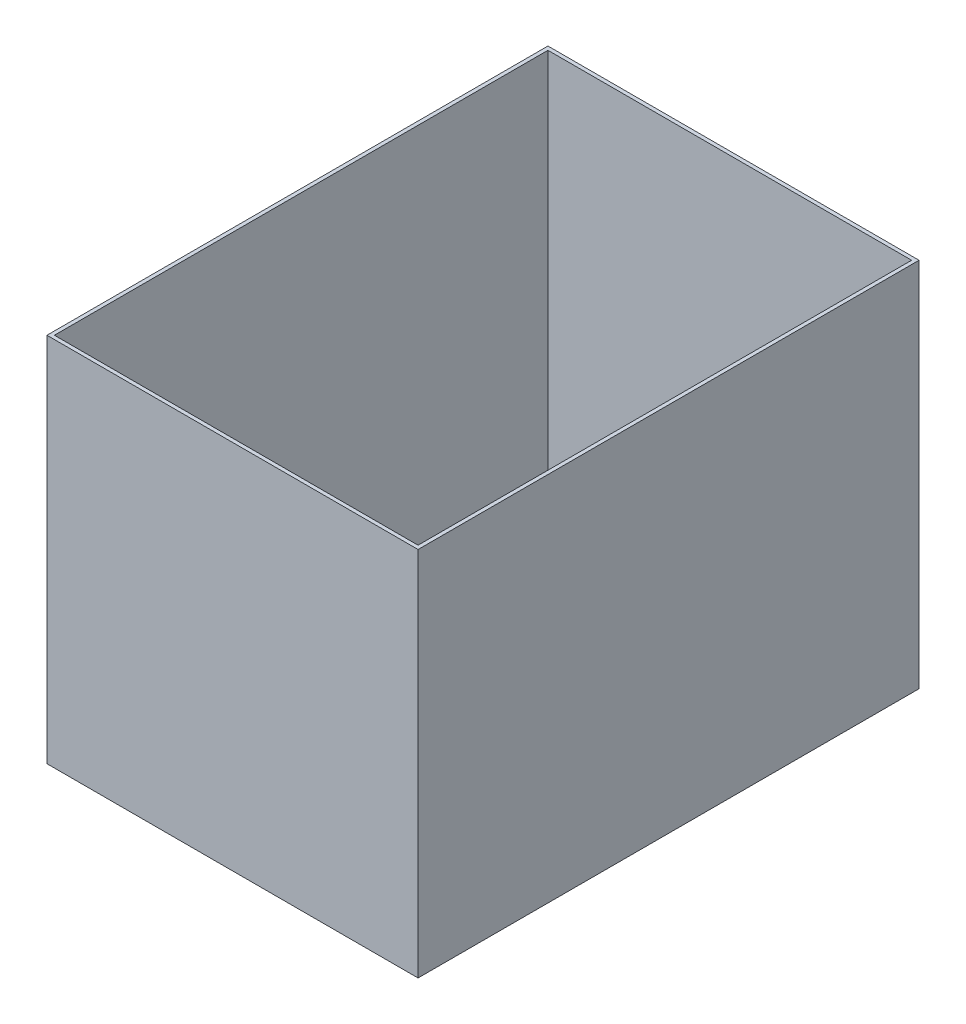
ISO-10303-21;
HEADER;
FILE_DESCRIPTION(('STEP AP214'),'2;1');
FILE_NAME('part.step','',(''),(''),'','','');
FILE_SCHEMA(('AUTOMOTIVE_DESIGN { 1 0 10303 214 1 1 1 1 }'));
ENDSEC;
DATA;
#1=APPLICATION_CONTEXT('core data for automotive mechanical design processes');
#2=APPLICATION_PROTOCOL_DEFINITION('international standard','automotive_design',2000,#1);
#3=PRODUCT_CONTEXT('',#1,'mechanical');
#4=PRODUCT('Part','Part','',(#3));
#5=PRODUCT_RELATED_PRODUCT_CATEGORY('part','',(#4));
#6=PRODUCT_DEFINITION_FORMATION('','',#4);
#7=PRODUCT_DEFINITION_CONTEXT('part definition',#1,'design');
#8=PRODUCT_DEFINITION('design','',#6,#7);
#9=PRODUCT_DEFINITION_SHAPE('','',#8);
#10=(LENGTH_UNIT() NAMED_UNIT(*) SI_UNIT(.MILLI.,.METRE.));
#11=(NAMED_UNIT(*) PLANE_ANGLE_UNIT() SI_UNIT($,.RADIAN.));
#12=(NAMED_UNIT(*) SI_UNIT($,.STERADIAN.) SOLID_ANGLE_UNIT());
#13=UNCERTAINTY_MEASURE_WITH_UNIT(LENGTH_MEASURE(1.E-05),#10,'distance_accuracy_value','');
#14=(GEOMETRIC_REPRESENTATION_CONTEXT(3) GLOBAL_UNCERTAINTY_ASSIGNED_CONTEXT((#13)) GLOBAL_UNIT_ASSIGNED_CONTEXT((#10,
#11,#12)) REPRESENTATION_CONTEXT('',''));
#15=CARTESIAN_POINT('',(0.,0.,0.));
#16=DIRECTION('',(0.,0.,1.));
#17=DIRECTION('',(1.,0.,0.));
#18=AXIS2_PLACEMENT_3D('',#15,#16,#17);
#19=CARTESIAN_POINT('',(-100.,200.,-135.));
#20=DIRECTION('',(0.,0.,-1.));
#21=DIRECTION('',(-1.,0.,0.));
#22=AXIS2_PLACEMENT_3D('',#19,#20,#21);
#23=PLANE('',#22);
#24=DIRECTION('',(1.,0.,0.));
#25=VECTOR('',#24,1.);
#26=CARTESIAN_POINT('',(-100.,0.,-135.));
#27=LINE('',#26,#25);
#28=CARTESIAN_POINT('',(-100.,0.,-135.));
#29=VERTEX_POINT('',#28);
#30=CARTESIAN_POINT('',(100.,0.,-135.));
#31=VERTEX_POINT('',#30);
#32=EDGE_CURVE('E122',#29,#31,#27,.T.);
#33=ORIENTED_EDGE('',*,*,#32,.F.);
#34=DIRECTION('',(0.,-1.,0.));
#35=VECTOR('',#34,1.);
#36=CARTESIAN_POINT('',(-100.,200.,-135.));
#37=LINE('',#36,#35);
#38=CARTESIAN_POINT('',(-100.,200.,-135.));
#39=VERTEX_POINT('',#38);
#40=EDGE_CURVE('E11',#39,#29,#37,.T.);
#41=ORIENTED_EDGE('',*,*,#40,.F.);
#42=DIRECTION('',(1.,0.,0.));
#43=VECTOR('',#42,1.);
#44=CARTESIAN_POINT('',(-100.,200.,-135.));
#45=LINE('',#44,#43);
#46=CARTESIAN_POINT('',(100.,200.,-135.));
#47=VERTEX_POINT('',#46);
#48=EDGE_CURVE('E170',#39,#47,#45,.T.);
#49=ORIENTED_EDGE('',*,*,#48,.T.);
#50=DIRECTION('',(0.,-1.,0.));
#51=VECTOR('',#50,1.);
#52=CARTESIAN_POINT('',(100.,200.,-135.));
#53=LINE('',#52,#51);
#54=EDGE_CURVE('E87',#47,#31,#53,.T.);
#55=ORIENTED_EDGE('',*,*,#54,.T.);
#56=EDGE_LOOP('',(#33,#41,#49,#55));
#57=FACE_BOUND('',#56,.T.);
#58=ADVANCED_FACE('F38',(#57),#23,.T.);
#59=CARTESIAN_POINT('',(-100.,200.,-135.));
#60=DIRECTION('',(1.,0.,0.));
#61=DIRECTION('',(0.,0.,-1.));
#62=AXIS2_PLACEMENT_3D('',#59,#60,#61);
#63=PLANE('',#62);
#64=DIRECTION('',(0.,0.,1.));
#65=VECTOR('',#64,1.);
#66=CARTESIAN_POINT('',(-100.,0.,-135.));
#67=LINE('',#66,#65);
#68=CARTESIAN_POINT('',(-100.,0.,135.));
#69=VERTEX_POINT('',#68);
#70=EDGE_CURVE('E174',#29,#69,#67,.T.);
#71=ORIENTED_EDGE('',*,*,#70,.T.);
#72=DIRECTION('',(0.,-1.,0.));
#73=VECTOR('',#72,1.);
#74=CARTESIAN_POINT('',(-100.,200.,135.));
#75=LINE('',#74,#73);
#76=CARTESIAN_POINT('',(-100.,200.,135.));
#77=VERTEX_POINT('',#76);
#78=EDGE_CURVE('E47',#77,#69,#75,.T.);
#79=ORIENTED_EDGE('',*,*,#78,.F.);
#80=DIRECTION('',(0.,0.,1.));
#81=VECTOR('',#80,1.);
#82=CARTESIAN_POINT('',(-100.,200.,-135.));
#83=LINE('',#82,#81);
#84=EDGE_CURVE('E180',#39,#77,#83,.T.);
#85=ORIENTED_EDGE('',*,*,#84,.F.);
#86=ORIENTED_EDGE('',*,*,#40,.T.);
#87=EDGE_LOOP('',(#71,#79,#85,#86));
#88=FACE_BOUND('',#87,.T.);
#89=ADVANCED_FACE('F234',(#88),#63,.F.);
#90=CARTESIAN_POINT('',(-100.,200.,135.));
#91=DIRECTION('',(0.,0.,-1.));
#92=DIRECTION('',(-1.,0.,0.));
#93=AXIS2_PLACEMENT_3D('',#90,#91,#92);
#94=PLANE('',#93);
#95=DIRECTION('',(1.,0.,0.));
#96=VECTOR('',#95,1.);
#97=CARTESIAN_POINT('',(-100.,0.,135.));
#98=LINE('',#97,#96);
#99=CARTESIAN_POINT('',(100.,0.,135.));
#100=VERTEX_POINT('',#99);
#101=EDGE_CURVE('E190',#69,#100,#98,.T.);
#102=ORIENTED_EDGE('',*,*,#101,.T.);
#103=DIRECTION('',(0.,-1.,0.));
#104=VECTOR('',#103,1.);
#105=CARTESIAN_POINT('',(100.,200.,135.));
#106=LINE('',#105,#104);
#107=CARTESIAN_POINT('',(100.,200.,135.));
#108=VERTEX_POINT('',#107);
#109=EDGE_CURVE('E199',#108,#100,#106,.T.);
#110=ORIENTED_EDGE('',*,*,#109,.F.);
#111=DIRECTION('',(1.,0.,0.));
#112=VECTOR('',#111,1.);
#113=CARTESIAN_POINT('',(-100.,200.,135.));
#114=LINE('',#113,#112);
#115=EDGE_CURVE('E177',#77,#108,#114,.T.);
#116=ORIENTED_EDGE('',*,*,#115,.F.);
#117=ORIENTED_EDGE('',*,*,#78,.T.);
#118=EDGE_LOOP('',(#102,#110,#116,#117));
#119=FACE_BOUND('',#118,.T.);
#120=ADVANCED_FACE('F238',(#119),#94,.F.);
#121=CARTESIAN_POINT('',(100.,200.,-135.));
#122=DIRECTION('',(1.,0.,0.));
#123=DIRECTION('',(0.,0.,-1.));
#124=AXIS2_PLACEMENT_3D('',#121,#122,#123);
#125=PLANE('',#124);
#126=DIRECTION('',(0.,0.,1.));
#127=VECTOR('',#126,1.);
#128=CARTESIAN_POINT('',(100.,0.,-135.));
#129=LINE('',#128,#127);
#130=EDGE_CURVE('E186',#31,#100,#129,.T.);
#131=ORIENTED_EDGE('',*,*,#130,.F.);
#132=ORIENTED_EDGE('',*,*,#54,.F.);
#133=DIRECTION('',(0.,0.,1.));
#134=VECTOR('',#133,1.);
#135=CARTESIAN_POINT('',(100.,200.,-135.));
#136=LINE('',#135,#134);
#137=EDGE_CURVE('E173',#47,#108,#136,.T.);
#138=ORIENTED_EDGE('',*,*,#137,.T.);
#139=ORIENTED_EDGE('',*,*,#109,.T.);
#140=EDGE_LOOP('',(#131,#132,#138,#139));
#141=FACE_BOUND('',#140,.T.);
#142=ADVANCED_FACE('F250',(#141),#125,.T.);
#143=CARTESIAN_POINT('',(0.,200.,0.));
#144=DIRECTION('',(0.,-1.,0.));
#145=DIRECTION('',(0.,0.,-1.));
#146=AXIS2_PLACEMENT_3D('',#143,#144,#145);
#147=PLANE('',#146);
#148=DIRECTION('',(0.,0.,1.));
#149=VECTOR('',#148,1.);
#150=CARTESIAN_POINT('',(-98.,200.,0.));
#151=LINE('',#150,#149);
#152=CARTESIAN_POINT('',(-98.,200.,-133.));
#153=VERTEX_POINT('',#152);
#154=CARTESIAN_POINT('',(-98.,200.,133.));
#155=VERTEX_POINT('',#154);
#156=EDGE_CURVE('E151',#153,#155,#151,.T.);
#157=ORIENTED_EDGE('',*,*,#156,.F.);
#158=DIRECTION('',(1.,0.,0.));
#159=VECTOR('',#158,1.);
#160=CARTESIAN_POINT('',(0.,200.,-133.));
#161=LINE('',#160,#159);
#162=CARTESIAN_POINT('',(98.,200.,-133.));
#163=VERTEX_POINT('',#162);
#164=EDGE_CURVE('E118',#153,#163,#161,.T.);
#165=ORIENTED_EDGE('',*,*,#164,.T.);
#166=DIRECTION('',(0.,0.,1.));
#167=VECTOR('',#166,1.);
#168=CARTESIAN_POINT('',(98.,200.,0.));
#169=LINE('',#168,#167);
#170=CARTESIAN_POINT('',(98.,200.,133.));
#171=VERTEX_POINT('',#170);
#172=EDGE_CURVE('E161',#163,#171,#169,.T.);
#173=ORIENTED_EDGE('',*,*,#172,.T.);
#174=DIRECTION('',(1.,0.,0.));
#175=VECTOR('',#174,1.);
#176=CARTESIAN_POINT('',(0.,200.,133.));
#177=LINE('',#176,#175);
#178=EDGE_CURVE('E164',#155,#171,#177,.T.);
#179=ORIENTED_EDGE('',*,*,#178,.F.);
#180=EDGE_LOOP('',(#157,#165,#173,#179));
#181=FACE_BOUND('',#180,.T.);
#182=ORIENTED_EDGE('',*,*,#48,.F.);
#183=ORIENTED_EDGE('',*,*,#84,.T.);
#184=ORIENTED_EDGE('',*,*,#115,.T.);
#185=ORIENTED_EDGE('',*,*,#137,.F.);
#186=EDGE_LOOP('',(#182,#183,#184,#185));
#187=FACE_BOUND('',#186,.T.);
#188=ADVANCED_FACE('F249',(#181,#187),#147,.F.);
#189=CARTESIAN_POINT('',(0.,0.,0.));
#190=DIRECTION('',(0.,-1.,0.));
#191=DIRECTION('',(0.,0.,-1.));
#192=AXIS2_PLACEMENT_3D('',#189,#190,#191);
#193=PLANE('',#192);
#194=CARTESIAN_POINT('',(-90.,0.,-125.));
#195=DIRECTION('',(0.,-1.,0.));
#196=DIRECTION('',(0.,0.,1.));
#197=AXIS2_PLACEMENT_3D('',#194,#195,#196);
#198=CIRCLE('',#197,3.50000000000001);
#199=CARTESIAN_POINT('',(-90.,0.,-121.5));
#200=VERTEX_POINT('',#199);
#201=EDGE_CURVE('E295',#200,#200,#198,.T.);
#202=ORIENTED_EDGE('',*,*,#201,.F.);
#203=EDGE_LOOP('',(#202));
#204=FACE_BOUND('',#203,.T.);
#205=CARTESIAN_POINT('',(90.,0.,-125.));
#206=DIRECTION('',(0.,-1.,0.));
#207=DIRECTION('',(0.,0.,-1.));
#208=AXIS2_PLACEMENT_3D('',#205,#206,#207);
#209=CIRCLE('',#208,3.50000000000001);
#210=CARTESIAN_POINT('',(90.,0.,-128.5));
#211=VERTEX_POINT('',#210);
#212=EDGE_CURVE('E291',#211,#211,#209,.T.);
#213=ORIENTED_EDGE('',*,*,#212,.F.);
#214=EDGE_LOOP('',(#213));
#215=FACE_BOUND('',#214,.T.);
#216=CARTESIAN_POINT('',(90.,0.,125.));
#217=DIRECTION('',(0.,-1.,0.));
#218=DIRECTION('',(0.,0.,1.));
#219=AXIS2_PLACEMENT_3D('',#216,#217,#218);
#220=CIRCLE('',#219,3.50000000000001);
#221=CARTESIAN_POINT('',(90.,0.,128.5));
#222=VERTEX_POINT('',#221);
#223=EDGE_CURVE('E288',#222,#222,#220,.T.);
#224=ORIENTED_EDGE('',*,*,#223,.F.);
#225=EDGE_LOOP('',(#224));
#226=FACE_BOUND('',#225,.T.);
#227=CARTESIAN_POINT('',(-90.,0.,125.));
#228=DIRECTION('',(0.,-1.,0.));
#229=DIRECTION('',(0.,0.,-1.));
#230=AXIS2_PLACEMENT_3D('',#227,#228,#229);
#231=CIRCLE('',#230,3.50000000000001);
#232=CARTESIAN_POINT('',(-90.,0.,121.5));
#233=VERTEX_POINT('',#232);
#234=EDGE_CURVE('E146',#233,#233,#231,.T.);
#235=ORIENTED_EDGE('',*,*,#234,.F.);
#236=EDGE_LOOP('',(#235));
#237=FACE_BOUND('',#236,.T.);
#238=ORIENTED_EDGE('',*,*,#32,.T.);
#239=ORIENTED_EDGE('',*,*,#130,.T.);
#240=ORIENTED_EDGE('',*,*,#101,.F.);
#241=ORIENTED_EDGE('',*,*,#70,.F.);
#242=EDGE_LOOP('',(#238,#239,#240,#241));
#243=FACE_BOUND('',#242,.T.);
#244=ADVANCED_FACE('F241',(#204,#215,#226,#237,#243),#193,.T.);
#245=CARTESIAN_POINT('',(-100.,200.,-133.));
#246=DIRECTION('',(0.,0.,-1.));
#247=DIRECTION('',(-1.,0.,0.));
#248=AXIS2_PLACEMENT_3D('',#245,#246,#247);
#249=PLANE('',#248);
#250=DIRECTION('',(1.,0.,0.));
#251=VECTOR('',#250,1.);
#252=CARTESIAN_POINT('',(0.,2.,-133.));
#253=LINE('',#252,#251);
#254=CARTESIAN_POINT('',(-98.,2.,-133.));
#255=VERTEX_POINT('',#254);
#256=CARTESIAN_POINT('',(98.,2.,-133.));
#257=VERTEX_POINT('',#256);
#258=EDGE_CURVE('E116',#255,#257,#253,.T.);
#259=ORIENTED_EDGE('',*,*,#258,.T.);
#260=DIRECTION('',(0.,-1.,0.));
#261=VECTOR('',#260,1.);
#262=CARTESIAN_POINT('',(98.,200.,-133.));
#263=LINE('',#262,#261);
#264=EDGE_CURVE('E149',#163,#257,#263,.T.);
#265=ORIENTED_EDGE('',*,*,#264,.F.);
#266=ORIENTED_EDGE('',*,*,#164,.F.);
#267=DIRECTION('',(0.,-1.,0.));
#268=VECTOR('',#267,1.);
#269=CARTESIAN_POINT('',(-98.,200.,-133.));
#270=LINE('',#269,#268);
#271=EDGE_CURVE('E112',#153,#255,#270,.T.);
#272=ORIENTED_EDGE('',*,*,#271,.T.);
#273=EDGE_LOOP('',(#259,#265,#266,#272));
#274=FACE_BOUND('',#273,.T.);
#275=ADVANCED_FACE('F114',(#274),#249,.F.);
#276=CARTESIAN_POINT('',(-98.,200.,-135.));
#277=DIRECTION('',(1.,0.,0.));
#278=DIRECTION('',(0.,0.,-1.));
#279=AXIS2_PLACEMENT_3D('',#276,#277,#278);
#280=PLANE('',#279);
#281=DIRECTION('',(0.,0.,1.));
#282=VECTOR('',#281,1.);
#283=CARTESIAN_POINT('',(-98.,2.,0.));
#284=LINE('',#283,#282);
#285=CARTESIAN_POINT('',(-98.,2.,133.));
#286=VERTEX_POINT('',#285);
#287=EDGE_CURVE('E126',#255,#286,#284,.T.);
#288=ORIENTED_EDGE('',*,*,#287,.F.);
#289=ORIENTED_EDGE('',*,*,#271,.F.);
#290=ORIENTED_EDGE('',*,*,#156,.T.);
#291=DIRECTION('',(0.,-1.,0.));
#292=VECTOR('',#291,1.);
#293=CARTESIAN_POINT('',(-98.,200.,133.));
#294=LINE('',#293,#292);
#295=EDGE_CURVE('E123',#155,#286,#294,.T.);
#296=ORIENTED_EDGE('',*,*,#295,.T.);
#297=EDGE_LOOP('',(#288,#289,#290,#296));
#298=FACE_BOUND('',#297,.T.);
#299=ADVANCED_FACE('F127',(#298),#280,.T.);
#300=CARTESIAN_POINT('',(-100.,200.,133.));
#301=DIRECTION('',(0.,0.,-1.));
#302=DIRECTION('',(-1.,0.,0.));
#303=AXIS2_PLACEMENT_3D('',#300,#301,#302);
#304=PLANE('',#303);
#305=DIRECTION('',(1.,0.,0.));
#306=VECTOR('',#305,1.);
#307=CARTESIAN_POINT('',(0.,2.,133.));
#308=LINE('',#307,#306);
#309=CARTESIAN_POINT('',(98.,2.,133.));
#310=VERTEX_POINT('',#309);
#311=EDGE_CURVE('E133',#286,#310,#308,.T.);
#312=ORIENTED_EDGE('',*,*,#311,.F.);
#313=ORIENTED_EDGE('',*,*,#295,.F.);
#314=ORIENTED_EDGE('',*,*,#178,.T.);
#315=DIRECTION('',(0.,-1.,0.));
#316=VECTOR('',#315,1.);
#317=CARTESIAN_POINT('',(98.,200.,133.));
#318=LINE('',#317,#316);
#319=EDGE_CURVE('E55',#171,#310,#318,.T.);
#320=ORIENTED_EDGE('',*,*,#319,.T.);
#321=EDGE_LOOP('',(#312,#313,#314,#320));
#322=FACE_BOUND('',#321,.T.);
#323=ADVANCED_FACE('F269',(#322),#304,.T.);
#324=CARTESIAN_POINT('',(98.,200.,-135.));
#325=DIRECTION('',(1.,0.,0.));
#326=DIRECTION('',(0.,0.,-1.));
#327=AXIS2_PLACEMENT_3D('',#324,#325,#326);
#328=PLANE('',#327);
#329=DIRECTION('',(0.,0.,1.));
#330=VECTOR('',#329,1.);
#331=CARTESIAN_POINT('',(98.,2.,0.));
#332=LINE('',#331,#330);
#333=EDGE_CURVE('E137',#257,#310,#332,.T.);
#334=ORIENTED_EDGE('',*,*,#333,.T.);
#335=ORIENTED_EDGE('',*,*,#319,.F.);
#336=ORIENTED_EDGE('',*,*,#172,.F.);
#337=ORIENTED_EDGE('',*,*,#264,.T.);
#338=EDGE_LOOP('',(#334,#335,#336,#337));
#339=FACE_BOUND('',#338,.T.);
#340=ADVANCED_FACE('F265',(#339),#328,.F.);
#341=CARTESIAN_POINT('',(0.,2.,0.));
#342=DIRECTION('',(0.,-1.,0.));
#343=DIRECTION('',(0.,0.,-1.));
#344=AXIS2_PLACEMENT_3D('',#341,#342,#343);
#345=PLANE('',#344);
#346=CARTESIAN_POINT('',(-90.,2.,-125.));
#347=DIRECTION('',(0.,-1.,0.));
#348=DIRECTION('',(0.,0.,-1.));
#349=AXIS2_PLACEMENT_3D('',#346,#347,#348);
#350=CIRCLE('',#349,3.50000000000001);
#351=CARTESIAN_POINT('',(-90.,2.,-128.5));
#352=VERTEX_POINT('',#351);
#353=EDGE_CURVE('E41',#352,#352,#350,.T.);
#354=ORIENTED_EDGE('',*,*,#353,.T.);
#355=EDGE_LOOP('',(#354));
#356=FACE_BOUND('',#355,.T.);
#357=CARTESIAN_POINT('',(90.,2.,-125.));
#358=DIRECTION('',(0.,-1.,0.));
#359=DIRECTION('',(0.,0.,-1.));
#360=AXIS2_PLACEMENT_3D('',#357,#358,#359);
#361=CIRCLE('',#360,3.50000000000001);
#362=CARTESIAN_POINT('',(90.,2.,-128.5));
#363=VERTEX_POINT('',#362);
#364=EDGE_CURVE('E144',#363,#363,#361,.T.);
#365=ORIENTED_EDGE('',*,*,#364,.T.);
#366=EDGE_LOOP('',(#365));
#367=FACE_BOUND('',#366,.T.);
#368=CARTESIAN_POINT('',(90.,2.,125.));
#369=DIRECTION('',(0.,-1.,0.));
#370=DIRECTION('',(0.,0.,-1.));
#371=AXIS2_PLACEMENT_3D('',#368,#369,#370);
#372=CIRCLE('',#371,3.50000000000001);
#373=CARTESIAN_POINT('',(90.,2.,121.5));
#374=VERTEX_POINT('',#373);
#375=EDGE_CURVE('E208',#374,#374,#372,.T.);
#376=ORIENTED_EDGE('',*,*,#375,.T.);
#377=EDGE_LOOP('',(#376));
#378=FACE_BOUND('',#377,.T.);
#379=CARTESIAN_POINT('',(-90.,2.,125.));
#380=DIRECTION('',(0.,-1.,0.));
#381=DIRECTION('',(0.,0.,-1.));
#382=AXIS2_PLACEMENT_3D('',#379,#380,#381);
#383=CIRCLE('',#382,3.50000000000001);
#384=CARTESIAN_POINT('',(-90.,2.,121.5));
#385=VERTEX_POINT('',#384);
#386=EDGE_CURVE('E204',#385,#385,#383,.T.);
#387=ORIENTED_EDGE('',*,*,#386,.T.);
#388=EDGE_LOOP('',(#387));
#389=FACE_BOUND('',#388,.T.);
#390=ORIENTED_EDGE('',*,*,#258,.F.);
#391=ORIENTED_EDGE('',*,*,#287,.T.);
#392=ORIENTED_EDGE('',*,*,#311,.T.);
#393=ORIENTED_EDGE('',*,*,#333,.F.);
#394=EDGE_LOOP('',(#390,#391,#392,#393));
#395=FACE_BOUND('',#394,.T.);
#396=ADVANCED_FACE('F136',(#356,#367,#378,#389,#395),#345,.F.);
#397=CARTESIAN_POINT('',(-90.,10.,125.));
#398=DIRECTION('',(0.,-1.,0.));
#399=DIRECTION('',(0.,0.,-1.));
#400=AXIS2_PLACEMENT_3D('',#397,#398,#399);
#401=CYLINDRICAL_SURFACE('',#400,3.50000000000001);
#402=ORIENTED_EDGE('',*,*,#234,.T.);
#403=EDGE_LOOP('',(#402));
#404=FACE_BOUND('',#403,.T.);
#405=ORIENTED_EDGE('',*,*,#386,.F.);
#406=EDGE_LOOP('',(#405));
#407=FACE_BOUND('',#406,.T.);
#408=ADVANCED_FACE('F229',(#404,#407),#401,.F.);
#409=CARTESIAN_POINT('',(90.,10.,125.));
#410=DIRECTION('',(0.,-1.,0.));
#411=DIRECTION('',(0.,0.,-1.));
#412=AXIS2_PLACEMENT_3D('',#409,#410,#411);
#413=CYLINDRICAL_SURFACE('',#412,3.50000000000001);
#414=ORIENTED_EDGE('',*,*,#223,.T.);
#415=EDGE_LOOP('',(#414));
#416=FACE_BOUND('',#415,.T.);
#417=ORIENTED_EDGE('',*,*,#375,.F.);
#418=EDGE_LOOP('',(#417));
#419=FACE_BOUND('',#418,.T.);
#420=ADVANCED_FACE('F220',(#416,#419),#413,.F.);
#421=CARTESIAN_POINT('',(90.,10.,-125.));
#422=DIRECTION('',(0.,-1.,0.));
#423=DIRECTION('',(0.,0.,-1.));
#424=AXIS2_PLACEMENT_3D('',#421,#422,#423);
#425=CYLINDRICAL_SURFACE('',#424,3.50000000000001);
#426=ORIENTED_EDGE('',*,*,#212,.T.);
#427=EDGE_LOOP('',(#426));
#428=FACE_BOUND('',#427,.T.);
#429=ORIENTED_EDGE('',*,*,#364,.F.);
#430=EDGE_LOOP('',(#429));
#431=FACE_BOUND('',#430,.T.);
#432=ADVANCED_FACE('F217',(#428,#431),#425,.F.);
#433=CARTESIAN_POINT('',(-90.,10.,-125.));
#434=DIRECTION('',(0.,-1.,0.));
#435=DIRECTION('',(0.,0.,-1.));
#436=AXIS2_PLACEMENT_3D('',#433,#434,#435);
#437=CYLINDRICAL_SURFACE('',#436,3.50000000000001);
#438=ORIENTED_EDGE('',*,*,#201,.T.);
#439=EDGE_LOOP('',(#438));
#440=FACE_BOUND('',#439,.T.);
#441=ORIENTED_EDGE('',*,*,#353,.F.);
#442=EDGE_LOOP('',(#441));
#443=FACE_BOUND('',#442,.T.);
#444=ADVANCED_FACE('F219',(#440,#443),#437,.F.);
#445=CLOSED_SHELL('',(#58,#89,#120,#142,#188,#244,#275,#299,#323,#340,#396,#408,#420,#432,#444));
#446=MANIFOLD_SOLID_BREP('B2',#445);
#447=ADVANCED_BREP_SHAPE_REPRESENTATION('',(#18,#446),#14);
#448=SHAPE_DEFINITION_REPRESENTATION(#9,#447);
ENDSEC;
END-ISO-10303-21;
